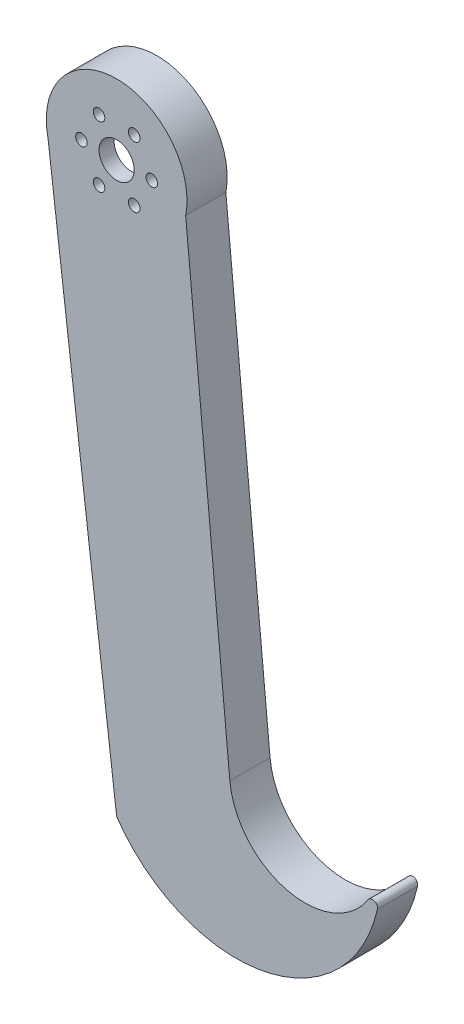
ISO-10303-21;
HEADER;
FILE_DESCRIPTION(('STEP AP214'),'2;1');
FILE_NAME('part.step','',(''),(''),'','','');
FILE_SCHEMA(('AUTOMOTIVE_DESIGN { 1 0 10303 214 1 1 1 1 }'));
ENDSEC;
DATA;
#1=APPLICATION_CONTEXT('core data for automotive mechanical design processes');
#2=APPLICATION_PROTOCOL_DEFINITION('international standard','automotive_design',2000,#1);
#3=PRODUCT_CONTEXT('',#1,'mechanical');
#4=PRODUCT('Part','Part','',(#3));
#5=PRODUCT_RELATED_PRODUCT_CATEGORY('part','',(#4));
#6=PRODUCT_DEFINITION_FORMATION('','',#4);
#7=PRODUCT_DEFINITION_CONTEXT('part definition',#1,'design');
#8=PRODUCT_DEFINITION('design','',#6,#7);
#9=PRODUCT_DEFINITION_SHAPE('','',#8);
#10=(LENGTH_UNIT() NAMED_UNIT(*) SI_UNIT(.MILLI.,.METRE.));
#11=(NAMED_UNIT(*) PLANE_ANGLE_UNIT() SI_UNIT($,.RADIAN.));
#12=(NAMED_UNIT(*) SI_UNIT($,.STERADIAN.) SOLID_ANGLE_UNIT());
#13=UNCERTAINTY_MEASURE_WITH_UNIT(LENGTH_MEASURE(1.E-05),#10,'distance_accuracy_value','');
#14=(GEOMETRIC_REPRESENTATION_CONTEXT(3) GLOBAL_UNCERTAINTY_ASSIGNED_CONTEXT((#13)) GLOBAL_UNIT_ASSIGNED_CONTEXT((#10,
#11,#12)) REPRESENTATION_CONTEXT('',''));
#15=CARTESIAN_POINT('',(0.,0.,0.));
#16=DIRECTION('',(0.,0.,1.));
#17=DIRECTION('',(1.,0.,0.));
#18=AXIS2_PLACEMENT_3D('',#15,#16,#17);
#19=CARTESIAN_POINT('',(0.,0.,-2.));
#20=DIRECTION('',(0.,0.,1.));
#21=DIRECTION('',(1.,0.,0.));
#22=AXIS2_PLACEMENT_3D('',#19,#20,#21);
#23=CYLINDRICAL_SURFACE('',#22,3.5);
#24=CARTESIAN_POINT('',(0.,0.,8.));
#25=DIRECTION('',(0.,0.,1.));
#26=DIRECTION('',(1.,0.,0.));
#27=AXIS2_PLACEMENT_3D('',#24,#25,#26);
#28=CIRCLE('',#27,3.5);
#29=CARTESIAN_POINT('',(3.5,0.,8.));
#30=VERTEX_POINT('',#29);
#31=EDGE_CURVE('E131',#30,#30,#28,.T.);
#32=ORIENTED_EDGE('',*,*,#31,.T.);
#33=EDGE_LOOP('',(#32));
#34=FACE_BOUND('',#33,.T.);
#35=CARTESIAN_POINT('',(0.,0.,5.));
#36=DIRECTION('',(0.,0.,-1.));
#37=DIRECTION('',(-1.,0.,0.));
#38=AXIS2_PLACEMENT_3D('',#35,#36,#37);
#39=CIRCLE('',#38,3.5);
#40=CARTESIAN_POINT('',(-3.5,0.,5.));
#41=VERTEX_POINT('',#40);
#42=EDGE_CURVE('E125',#41,#41,#39,.F.);
#43=ORIENTED_EDGE('',*,*,#42,.F.);
#44=EDGE_LOOP('',(#43));
#45=FACE_BOUND('',#44,.T.);
#46=ADVANCED_FACE('F33',(#34,#45),#23,.F.);
#47=CARTESIAN_POINT('',(0.,0.,8.));
#48=DIRECTION('',(0.,0.,-1.));
#49=DIRECTION('',(-1.,0.,0.));
#50=AXIS2_PLACEMENT_3D('',#47,#48,#49);
#51=CYLINDRICAL_SURFACE('',#50,14.);
#52=CARTESIAN_POINT('',(0.,0.,8.));
#53=DIRECTION('',(0.,0.,1.));
#54=DIRECTION('',(1.,0.,0.));
#55=AXIS2_PLACEMENT_3D('',#52,#53,#54);
#56=CIRCLE('',#55,14.);
#57=CARTESIAN_POINT('',(13.7355783574531,-2.70811506148946,8.));
#58=VERTEX_POINT('',#57);
#59=CARTESIAN_POINT('',(-13.6489972699894,-3.11526459932731,8.));
#60=VERTEX_POINT('',#59);
#61=EDGE_CURVE('E135',#58,#60,#56,.T.);
#62=ORIENTED_EDGE('',*,*,#61,.F.);
#63=DIRECTION('',(0.,0.,1.));
#64=VECTOR('',#63,1.);
#65=CARTESIAN_POINT('',(13.7355783574531,-2.70811506148946,0.));
#66=LINE('',#65,#64);
#67=CARTESIAN_POINT('',(13.7355783574531,-2.70811506148946,0.));
#68=VERTEX_POINT('',#67);
#69=EDGE_CURVE('E111',#68,#58,#66,.T.);
#70=ORIENTED_EDGE('',*,*,#69,.F.);
#71=CARTESIAN_POINT('',(0.,0.,0.));
#72=DIRECTION('',(0.,0.,1.));
#73=DIRECTION('',(1.,0.,0.));
#74=AXIS2_PLACEMENT_3D('',#71,#72,#73);
#75=CIRCLE('',#74,14.);
#76=CARTESIAN_POINT('',(-13.6489972699894,-3.11526459932731,0.));
#77=VERTEX_POINT('',#76);
#78=EDGE_CURVE('E116',#68,#77,#75,.T.);
#79=ORIENTED_EDGE('',*,*,#78,.T.);
#80=DIRECTION('',(0.,0.,1.));
#81=VECTOR('',#80,1.);
#82=CARTESIAN_POINT('',(-13.6489972699894,-3.11526459932734,0.));
#83=LINE('',#82,#81);
#84=EDGE_CURVE('E112',#77,#60,#83,.T.);
#85=ORIENTED_EDGE('',*,*,#84,.T.);
#86=EDGE_LOOP('',(#62,#70,#79,#85));
#87=FACE_BOUND('',#86,.T.);
#88=ADVANCED_FACE('F163',(#87),#51,.T.);
#89=CARTESIAN_POINT('',(0.,0.,8.));
#90=DIRECTION('',(0.,0.,1.));
#91=DIRECTION('',(1.,0.,0.));
#92=AXIS2_PLACEMENT_3D('',#89,#90,#91);
#93=PLANE('',#92);
#94=CARTESIAN_POINT('',(-3.50000000000007,6.06217782649103,8.));
#95=DIRECTION('',(0.,0.,1.));
#96=DIRECTION('',(1.,0.,0.));
#97=AXIS2_PLACEMENT_3D('',#94,#95,#96);
#98=CIRCLE('',#97,1.15);
#99=CARTESIAN_POINT('',(-2.35000000000007,6.06217782649103,8.));
#100=VERTEX_POINT('',#99);
#101=EDGE_CURVE('E201',#100,#100,#98,.T.);
#102=ORIENTED_EDGE('',*,*,#101,.F.);
#103=EDGE_LOOP('',(#102));
#104=FACE_BOUND('',#103,.T.);
#105=CARTESIAN_POINT('',(3.49999999999994,6.06217782649111,8.));
#106=DIRECTION('',(0.,0.,1.));
#107=DIRECTION('',(1.,0.,0.));
#108=AXIS2_PLACEMENT_3D('',#105,#106,#107);
#109=CIRCLE('',#108,1.15);
#110=CARTESIAN_POINT('',(4.64999999999994,6.06217782649111,8.));
#111=VERTEX_POINT('',#110);
#112=EDGE_CURVE('E195',#111,#111,#109,.T.);
#113=ORIENTED_EDGE('',*,*,#112,.F.);
#114=EDGE_LOOP('',(#113));
#115=FACE_BOUND('',#114,.T.);
#116=CARTESIAN_POINT('',(7.,0.,8.));
#117=DIRECTION('',(0.,0.,1.));
#118=DIRECTION('',(1.,0.,0.));
#119=AXIS2_PLACEMENT_3D('',#116,#117,#118);
#120=CIRCLE('',#119,1.15);
#121=CARTESIAN_POINT('',(8.15,0.,8.));
#122=VERTEX_POINT('',#121);
#123=EDGE_CURVE('E189',#122,#122,#120,.T.);
#124=ORIENTED_EDGE('',*,*,#123,.F.);
#125=EDGE_LOOP('',(#124));
#126=FACE_BOUND('',#125,.T.);
#127=CARTESIAN_POINT('',(3.50000000000003,-6.06217782649106,8.));
#128=DIRECTION('',(0.,0.,1.));
#129=DIRECTION('',(1.,0.,0.));
#130=AXIS2_PLACEMENT_3D('',#127,#128,#129);
#131=CIRCLE('',#130,1.15);
#132=CARTESIAN_POINT('',(4.65000000000003,-6.06217782649106,8.));
#133=VERTEX_POINT('',#132);
#134=EDGE_CURVE('E183',#133,#133,#131,.T.);
#135=ORIENTED_EDGE('',*,*,#134,.F.);
#136=EDGE_LOOP('',(#135));
#137=FACE_BOUND('',#136,.T.);
#138=CARTESIAN_POINT('',(-3.49999999999999,-6.06217782649108,8.));
#139=DIRECTION('',(0.,0.,1.));
#140=DIRECTION('',(1.,0.,0.));
#141=AXIS2_PLACEMENT_3D('',#138,#139,#140);
#142=CIRCLE('',#141,1.15);
#143=CARTESIAN_POINT('',(-2.34999999999999,-6.06217782649108,8.));
#144=VERTEX_POINT('',#143);
#145=EDGE_CURVE('E177',#144,#144,#142,.T.);
#146=ORIENTED_EDGE('',*,*,#145,.F.);
#147=EDGE_LOOP('',(#146));
#148=FACE_BOUND('',#147,.T.);
#149=CARTESIAN_POINT('',(-7.,0.,8.));
#150=DIRECTION('',(0.,0.,1.));
#151=DIRECTION('',(1.,0.,0.));
#152=AXIS2_PLACEMENT_3D('',#149,#150,#151);
#153=CIRCLE('',#152,1.15);
#154=CARTESIAN_POINT('',(-5.85,0.,8.));
#155=VERTEX_POINT('',#154);
#156=EDGE_CURVE('E169',#155,#155,#153,.T.);
#157=ORIENTED_EDGE('',*,*,#156,.F.);
#158=EDGE_LOOP('',(#157));
#159=FACE_BOUND('',#158,.T.);
#160=ORIENTED_EDGE('',*,*,#31,.F.);
#161=EDGE_LOOP('',(#160));
#162=FACE_BOUND('',#161,.T.);
#163=DIRECTION('',(0.123137483900924,-0.992389621095742,0.));
#164=VECTOR('',#163,1.);
#165=CARTESIAN_POINT('',(-13.6489972699894,-3.11526459932734,8.));
#166=LINE('',#165,#164);
#167=CARTESIAN_POINT('',(-0.0300732699647852,-112.872898099379,8.));
#168=VERTEX_POINT('',#167);
#169=EDGE_CURVE('E122',#60,#168,#166,.T.);
#170=ORIENTED_EDGE('',*,*,#169,.T.);
#171=CARTESIAN_POINT('',(0.962316351130953,-112.749760615478,8.));
#172=DIRECTION('',(0.,0.,1.));
#173=DIRECTION('',(1.,0.,0.));
#174=AXIS2_PLACEMENT_3D('',#171,#172,#173);
#175=CIRCLE('',#174,1.);
#176=CARTESIAN_POINT('',(0.140884053214486,-113.320066656074,8.));
#177=VERTEX_POINT('',#176);
#178=EDGE_CURVE('E55',#168,#177,#175,.T.);
#179=ORIENTED_EDGE('',*,*,#178,.T.);
#180=CARTESIAN_POINT('',(23.790257885744,-96.9007210968576,8.));
#181=DIRECTION('',(0.,0.,1.));
#182=DIRECTION('',(1.,0.,0.));
#183=AXIS2_PLACEMENT_3D('',#180,#181,#182);
#184=CIRCLE('',#183,28.7904114465856);
#185=CARTESIAN_POINT('',(51.8873570072006,-103.180913149871,8.));
#186=VERTEX_POINT('',#185);
#187=EDGE_CURVE('E124',#177,#186,#184,.T.);
#188=ORIENTED_EDGE('',*,*,#187,.T.);
#189=CARTESIAN_POINT('',(50.9114383693727,-102.962778300889,8.));
#190=DIRECTION('',(0.,0.,1.));
#191=DIRECTION('',(1.,0.,0.));
#192=AXIS2_PLACEMENT_3D('',#189,#190,#191);
#193=CIRCLE('',#192,1.);
#194=CARTESIAN_POINT('',(50.0708413942103,-102.42111722111,8.));
#195=VERTEX_POINT('',#194);
#196=EDGE_CURVE('E145',#186,#195,#193,.T.);
#197=ORIENTED_EDGE('',*,*,#196,.T.);
#198=CARTESIAN_POINT('',(37.4618867667754,-94.2962010244166,8.));
#199=DIRECTION('',(0.,0.,-1.));
#200=DIRECTION('',(1.,0.,0.));
#201=AXIS2_PLACEMENT_3D('',#198,#199,#200);
#202=CIRCLE('',#201,15.);
#203=CARTESIAN_POINT('',(22.5284846509842,-95.7081150614895,8.));
#204=VERTEX_POINT('',#203);
#205=EDGE_CURVE('E127',#195,#204,#202,.T.);
#206=ORIENTED_EDGE('',*,*,#205,.T.);
#207=DIRECTION('',(-0.0941276024715207,0.995560141052746,0.));
#208=VECTOR('',#207,1.);
#209=CARTESIAN_POINT('',(13.7355783574531,-2.70811506148946,8.));
#210=LINE('',#209,#208);
#211=EDGE_CURVE('E110',#204,#58,#210,.T.);
#212=ORIENTED_EDGE('',*,*,#211,.T.);
#213=ORIENTED_EDGE('',*,*,#61,.T.);
#214=EDGE_LOOP('',(#170,#179,#188,#197,#206,#212,#213));
#215=FACE_BOUND('',#214,.T.);
#216=ADVANCED_FACE('F161',(#104,#115,#126,#137,#148,#159,#162,#215),#93,.T.);
#217=CARTESIAN_POINT('',(0.,0.,0.));
#218=DIRECTION('',(0.,0.,1.));
#219=DIRECTION('',(1.,0.,0.));
#220=AXIS2_PLACEMENT_3D('',#217,#218,#219);
#221=PLANE('',#220);
#222=CARTESIAN_POINT('',(0.,0.,0.));
#223=DIRECTION('',(0.,0.,-1.));
#224=DIRECTION('',(-1.,0.,0.));
#225=AXIS2_PLACEMENT_3D('',#222,#223,#224);
#226=CIRCLE('',#225,10.6);
#227=CARTESIAN_POINT('',(-10.6,0.,0.));
#228=VERTEX_POINT('',#227);
#229=EDGE_CURVE('E166',#228,#228,#226,.T.);
#230=ORIENTED_EDGE('',*,*,#229,.F.);
#231=EDGE_LOOP('',(#230));
#232=FACE_BOUND('',#231,.T.);
#233=CARTESIAN_POINT('',(23.790257885744,-96.9007210968576,0.));
#234=DIRECTION('',(0.,0.,1.));
#235=DIRECTION('',(1.,0.,0.));
#236=AXIS2_PLACEMENT_3D('',#233,#234,#235);
#237=CIRCLE('',#236,28.7904114465856);
#238=CARTESIAN_POINT('',(0.140884053214486,-113.320066656074,0.));
#239=VERTEX_POINT('',#238);
#240=CARTESIAN_POINT('',(51.8873570072006,-103.180913149871,0.));
#241=VERTEX_POINT('',#240);
#242=EDGE_CURVE('E103',#239,#241,#237,.T.);
#243=ORIENTED_EDGE('',*,*,#242,.F.);
#244=CARTESIAN_POINT('',(0.962316351130953,-112.749760615478,0.));
#245=DIRECTION('',(0.,0.,1.));
#246=DIRECTION('',(1.,0.,0.));
#247=AXIS2_PLACEMENT_3D('',#244,#245,#246);
#248=CIRCLE('',#247,1.);
#249=CARTESIAN_POINT('',(-0.0300732699647852,-112.872898099379,0.));
#250=VERTEX_POINT('',#249);
#251=EDGE_CURVE('E11',#239,#250,#248,.F.);
#252=ORIENTED_EDGE('',*,*,#251,.T.);
#253=DIRECTION('',(0.123137483900924,-0.992389621095742,0.));
#254=VECTOR('',#253,1.);
#255=CARTESIAN_POINT('',(-13.6489972699894,-3.11526459932734,0.));
#256=LINE('',#255,#254);
#257=EDGE_CURVE('E130',#77,#250,#256,.T.);
#258=ORIENTED_EDGE('',*,*,#257,.F.);
#259=ORIENTED_EDGE('',*,*,#78,.F.);
#260=DIRECTION('',(-0.0941276024715207,0.995560141052746,0.));
#261=VECTOR('',#260,1.);
#262=CARTESIAN_POINT('',(13.7355783574531,-2.70811506148946,0.));
#263=LINE('',#262,#261);
#264=CARTESIAN_POINT('',(22.5284846509842,-95.7081150614895,0.));
#265=VERTEX_POINT('',#264);
#266=EDGE_CURVE('E102',#265,#68,#263,.T.);
#267=ORIENTED_EDGE('',*,*,#266,.F.);
#268=CARTESIAN_POINT('',(37.4618867667754,-94.2962010244166,0.));
#269=DIRECTION('',(0.,0.,-1.));
#270=DIRECTION('',(1.,0.,0.));
#271=AXIS2_PLACEMENT_3D('',#268,#269,#270);
#272=CIRCLE('',#271,15.);
#273=CARTESIAN_POINT('',(50.0708413942103,-102.42111722111,0.));
#274=VERTEX_POINT('',#273);
#275=EDGE_CURVE('E90',#274,#265,#272,.T.);
#276=ORIENTED_EDGE('',*,*,#275,.F.);
#277=CARTESIAN_POINT('',(50.9114383693727,-102.962778300889,0.));
#278=DIRECTION('',(0.,0.,1.));
#279=DIRECTION('',(1.,0.,0.));
#280=AXIS2_PLACEMENT_3D('',#277,#278,#279);
#281=CIRCLE('',#280,1.);
#282=EDGE_CURVE('E148',#274,#241,#281,.F.);
#283=ORIENTED_EDGE('',*,*,#282,.T.);
#284=EDGE_LOOP('',(#243,#252,#258,#259,#267,#276,#283));
#285=FACE_BOUND('',#284,.T.);
#286=ADVANCED_FACE('F114',(#232,#285),#221,.F.);
#287=CARTESIAN_POINT('',(13.7355783574531,-2.70811506148946,0.));
#288=DIRECTION('',(0.995560141052746,0.0941276024715207,0.));
#289=DIRECTION('',(-0.0941276024715207,0.995560141052746,0.));
#290=AXIS2_PLACEMENT_3D('',#287,#288,#289);
#291=PLANE('',#290);
#292=ORIENTED_EDGE('',*,*,#211,.F.);
#293=DIRECTION('',(0.,0.,1.));
#294=VECTOR('',#293,1.);
#295=CARTESIAN_POINT('',(22.5284846509842,-95.7081150614895,0.));
#296=LINE('',#295,#294);
#297=EDGE_CURVE('E94',#265,#204,#296,.T.);
#298=ORIENTED_EDGE('',*,*,#297,.F.);
#299=ORIENTED_EDGE('',*,*,#266,.T.);
#300=ORIENTED_EDGE('',*,*,#69,.T.);
#301=EDGE_LOOP('',(#292,#298,#299,#300));
#302=FACE_BOUND('',#301,.T.);
#303=ADVANCED_FACE('F107',(#302),#291,.T.);
#304=CARTESIAN_POINT('',(37.4618867667754,-94.2962010244166,0.));
#305=DIRECTION('',(0.,0.,1.));
#306=DIRECTION('',(1.,0.,0.));
#307=AXIS2_PLACEMENT_3D('',#304,#305,#306);
#308=CYLINDRICAL_SURFACE('',#307,15.);
#309=ORIENTED_EDGE('',*,*,#205,.F.);
#310=DIRECTION('',(0.,0.,1.));
#311=VECTOR('',#310,1.);
#312=CARTESIAN_POINT('',(50.0708413942103,-102.42111722111,0.));
#313=LINE('',#312,#311);
#314=EDGE_CURVE('E97',#195,#274,#313,.F.);
#315=ORIENTED_EDGE('',*,*,#314,.T.);
#316=ORIENTED_EDGE('',*,*,#275,.T.);
#317=ORIENTED_EDGE('',*,*,#297,.T.);
#318=EDGE_LOOP('',(#309,#315,#316,#317));
#319=FACE_BOUND('',#318,.T.);
#320=ADVANCED_FACE('F93',(#319),#308,.F.);
#321=CARTESIAN_POINT('',(23.790257885744,-96.9007210968576,0.));
#322=DIRECTION('',(0.,0.,1.));
#323=DIRECTION('',(1.,0.,0.));
#324=AXIS2_PLACEMENT_3D('',#321,#322,#323);
#325=CYLINDRICAL_SURFACE('',#324,28.7904114465856);
#326=ORIENTED_EDGE('',*,*,#187,.F.);
#327=DIRECTION('',(0.,0.,1.));
#328=VECTOR('',#327,1.);
#329=CARTESIAN_POINT('',(0.140884053214489,-113.320066656074,0.));
#330=LINE('',#329,#328);
#331=EDGE_CURVE('E41',#177,#239,#330,.F.);
#332=ORIENTED_EDGE('',*,*,#331,.T.);
#333=ORIENTED_EDGE('',*,*,#242,.T.);
#334=DIRECTION('',(0.,0.,1.));
#335=VECTOR('',#334,1.);
#336=CARTESIAN_POINT('',(51.8873570072006,-103.180913149871,0.));
#337=LINE('',#336,#335);
#338=EDGE_CURVE('E138',#241,#186,#337,.T.);
#339=ORIENTED_EDGE('',*,*,#338,.T.);
#340=EDGE_LOOP('',(#326,#332,#333,#339));
#341=FACE_BOUND('',#340,.T.);
#342=ADVANCED_FACE('F256',(#341),#325,.T.);
#343=CARTESIAN_POINT('',(-13.6489972699894,-3.11526459932734,0.));
#344=DIRECTION('',(-0.992389621095742,-0.123137483900924,0.));
#345=DIRECTION('',(0.123137483900924,-0.992389621095742,0.));
#346=AXIS2_PLACEMENT_3D('',#343,#344,#345);
#347=PLANE('',#346);
#348=ORIENTED_EDGE('',*,*,#257,.T.);
#349=DIRECTION('',(0.,0.,1.));
#350=VECTOR('',#349,1.);
#351=CARTESIAN_POINT('',(-0.0300732699647886,-112.872898099379,0.));
#352=LINE('',#351,#350);
#353=EDGE_CURVE('E150',#250,#168,#352,.T.);
#354=ORIENTED_EDGE('',*,*,#353,.T.);
#355=ORIENTED_EDGE('',*,*,#169,.F.);
#356=ORIENTED_EDGE('',*,*,#84,.F.);
#357=EDGE_LOOP('',(#348,#354,#355,#356));
#358=FACE_BOUND('',#357,.T.);
#359=ADVANCED_FACE('F157',(#358),#347,.T.);
#360=CARTESIAN_POINT('',(0.,0.,5.));
#361=DIRECTION('',(0.,0.,-1.));
#362=DIRECTION('',(-1.,0.,0.));
#363=AXIS2_PLACEMENT_3D('',#360,#361,#362);
#364=PLANE('',#363);
#365=CARTESIAN_POINT('',(-3.50000000000007,6.06217782649103,5.));
#366=DIRECTION('',(0.,0.,-1.));
#367=DIRECTION('',(-1.,0.,0.));
#368=AXIS2_PLACEMENT_3D('',#365,#366,#367);
#369=CIRCLE('',#368,1.15);
#370=CARTESIAN_POINT('',(-4.65000000000007,6.06217782649103,5.));
#371=VERTEX_POINT('',#370);
#372=EDGE_CURVE('E204',#371,#371,#369,.T.);
#373=ORIENTED_EDGE('',*,*,#372,.F.);
#374=EDGE_LOOP('',(#373));
#375=FACE_BOUND('',#374,.T.);
#376=CARTESIAN_POINT('',(3.49999999999994,6.06217782649111,5.));
#377=DIRECTION('',(0.,0.,-1.));
#378=DIRECTION('',(-1.,0.,0.));
#379=AXIS2_PLACEMENT_3D('',#376,#377,#378);
#380=CIRCLE('',#379,1.15);
#381=CARTESIAN_POINT('',(2.34999999999994,6.06217782649111,5.));
#382=VERTEX_POINT('',#381);
#383=EDGE_CURVE('E198',#382,#382,#380,.T.);
#384=ORIENTED_EDGE('',*,*,#383,.F.);
#385=EDGE_LOOP('',(#384));
#386=FACE_BOUND('',#385,.T.);
#387=CARTESIAN_POINT('',(7.,0.,5.));
#388=DIRECTION('',(0.,0.,-1.));
#389=DIRECTION('',(-1.,0.,0.));
#390=AXIS2_PLACEMENT_3D('',#387,#388,#389);
#391=CIRCLE('',#390,1.15);
#392=CARTESIAN_POINT('',(5.85,0.,5.));
#393=VERTEX_POINT('',#392);
#394=EDGE_CURVE('E192',#393,#393,#391,.T.);
#395=ORIENTED_EDGE('',*,*,#394,.F.);
#396=EDGE_LOOP('',(#395));
#397=FACE_BOUND('',#396,.T.);
#398=CARTESIAN_POINT('',(3.50000000000003,-6.06217782649106,5.));
#399=DIRECTION('',(0.,0.,-1.));
#400=DIRECTION('',(-1.,0.,0.));
#401=AXIS2_PLACEMENT_3D('',#398,#399,#400);
#402=CIRCLE('',#401,1.15);
#403=CARTESIAN_POINT('',(2.35000000000003,-6.06217782649106,5.));
#404=VERTEX_POINT('',#403);
#405=EDGE_CURVE('E186',#404,#404,#402,.T.);
#406=ORIENTED_EDGE('',*,*,#405,.F.);
#407=EDGE_LOOP('',(#406));
#408=FACE_BOUND('',#407,.T.);
#409=CARTESIAN_POINT('',(-3.49999999999999,-6.06217782649108,5.));
#410=DIRECTION('',(0.,0.,-1.));
#411=DIRECTION('',(-1.,0.,0.));
#412=AXIS2_PLACEMENT_3D('',#409,#410,#411);
#413=CIRCLE('',#412,1.15);
#414=CARTESIAN_POINT('',(-4.64999999999999,-6.06217782649108,5.));
#415=VERTEX_POINT('',#414);
#416=EDGE_CURVE('E180',#415,#415,#413,.T.);
#417=ORIENTED_EDGE('',*,*,#416,.F.);
#418=EDGE_LOOP('',(#417));
#419=FACE_BOUND('',#418,.T.);
#420=CARTESIAN_POINT('',(-7.,0.,5.));
#421=DIRECTION('',(0.,0.,-1.));
#422=DIRECTION('',(-1.,0.,0.));
#423=AXIS2_PLACEMENT_3D('',#420,#421,#422);
#424=CIRCLE('',#423,1.15);
#425=CARTESIAN_POINT('',(-8.15,0.,5.));
#426=VERTEX_POINT('',#425);
#427=EDGE_CURVE('E174',#426,#426,#424,.T.);
#428=ORIENTED_EDGE('',*,*,#427,.F.);
#429=EDGE_LOOP('',(#428));
#430=FACE_BOUND('',#429,.T.);
#431=CARTESIAN_POINT('',(0.,0.,5.));
#432=DIRECTION('',(0.,0.,-1.));
#433=DIRECTION('',(-1.,0.,0.));
#434=AXIS2_PLACEMENT_3D('',#431,#432,#433);
#435=CIRCLE('',#434,10.6);
#436=CARTESIAN_POINT('',(-10.6,0.,5.));
#437=VERTEX_POINT('',#436);
#438=EDGE_CURVE('E142',#437,#437,#435,.T.);
#439=ORIENTED_EDGE('',*,*,#438,.T.);
#440=EDGE_LOOP('',(#439));
#441=FACE_BOUND('',#440,.T.);
#442=ORIENTED_EDGE('',*,*,#42,.T.);
#443=EDGE_LOOP('',(#442));
#444=FACE_BOUND('',#443,.T.);
#445=ADVANCED_FACE('F210',(#375,#386,#397,#408,#419,#430,#441,#444),#364,.T.);
#446=CARTESIAN_POINT('',(0.,0.,5.));
#447=DIRECTION('',(0.,0.,-1.));
#448=DIRECTION('',(-1.,0.,0.));
#449=AXIS2_PLACEMENT_3D('',#446,#447,#448);
#450=CYLINDRICAL_SURFACE('',#449,10.6);
#451=ORIENTED_EDGE('',*,*,#438,.F.);
#452=EDGE_LOOP('',(#451));
#453=FACE_BOUND('',#452,.T.);
#454=ORIENTED_EDGE('',*,*,#229,.T.);
#455=EDGE_LOOP('',(#454));
#456=FACE_BOUND('',#455,.T.);
#457=ADVANCED_FACE('F213',(#453,#456),#450,.F.);
#458=CARTESIAN_POINT('',(-7.,0.,10.));
#459=DIRECTION('',(0.,0.,-1.));
#460=DIRECTION('',(-1.,0.,0.));
#461=AXIS2_PLACEMENT_3D('',#458,#459,#460);
#462=CYLINDRICAL_SURFACE('',#461,1.15);
#463=ORIENTED_EDGE('',*,*,#156,.T.);
#464=EDGE_LOOP('',(#463));
#465=FACE_BOUND('',#464,.T.);
#466=ORIENTED_EDGE('',*,*,#427,.T.);
#467=EDGE_LOOP('',(#466));
#468=FACE_BOUND('',#467,.T.);
#469=ADVANCED_FACE('F267',(#465,#468),#462,.F.);
#470=CARTESIAN_POINT('',(-3.49999999999999,-6.06217782649108,10.));
#471=DIRECTION('',(0.,0.,-1.));
#472=DIRECTION('',(-1.,0.,0.));
#473=AXIS2_PLACEMENT_3D('',#470,#471,#472);
#474=CYLINDRICAL_SURFACE('',#473,1.15);
#475=ORIENTED_EDGE('',*,*,#145,.T.);
#476=EDGE_LOOP('',(#475));
#477=FACE_BOUND('',#476,.T.);
#478=ORIENTED_EDGE('',*,*,#416,.T.);
#479=EDGE_LOOP('',(#478));
#480=FACE_BOUND('',#479,.T.);
#481=ADVANCED_FACE('F272',(#477,#480),#474,.F.);
#482=CARTESIAN_POINT('',(3.50000000000003,-6.06217782649106,10.));
#483=DIRECTION('',(0.,0.,-1.));
#484=DIRECTION('',(-1.,0.,0.));
#485=AXIS2_PLACEMENT_3D('',#482,#483,#484);
#486=CYLINDRICAL_SURFACE('',#485,1.15);
#487=ORIENTED_EDGE('',*,*,#134,.T.);
#488=EDGE_LOOP('',(#487));
#489=FACE_BOUND('',#488,.T.);
#490=ORIENTED_EDGE('',*,*,#405,.T.);
#491=EDGE_LOOP('',(#490));
#492=FACE_BOUND('',#491,.T.);
#493=ADVANCED_FACE('F276',(#489,#492),#486,.F.);
#494=CARTESIAN_POINT('',(7.,0.,10.));
#495=DIRECTION('',(0.,0.,-1.));
#496=DIRECTION('',(-1.,0.,0.));
#497=AXIS2_PLACEMENT_3D('',#494,#495,#496);
#498=CYLINDRICAL_SURFACE('',#497,1.15);
#499=ORIENTED_EDGE('',*,*,#123,.T.);
#500=EDGE_LOOP('',(#499));
#501=FACE_BOUND('',#500,.T.);
#502=ORIENTED_EDGE('',*,*,#394,.T.);
#503=EDGE_LOOP('',(#502));
#504=FACE_BOUND('',#503,.T.);
#505=ADVANCED_FACE('F280',(#501,#504),#498,.F.);
#506=CARTESIAN_POINT('',(3.49999999999994,6.06217782649111,10.));
#507=DIRECTION('',(0.,0.,-1.));
#508=DIRECTION('',(-1.,0.,0.));
#509=AXIS2_PLACEMENT_3D('',#506,#507,#508);
#510=CYLINDRICAL_SURFACE('',#509,1.15);
#511=ORIENTED_EDGE('',*,*,#112,.T.);
#512=EDGE_LOOP('',(#511));
#513=FACE_BOUND('',#512,.T.);
#514=ORIENTED_EDGE('',*,*,#383,.T.);
#515=EDGE_LOOP('',(#514));
#516=FACE_BOUND('',#515,.T.);
#517=ADVANCED_FACE('F251',(#513,#516),#510,.F.);
#518=CARTESIAN_POINT('',(-3.50000000000007,6.06217782649103,10.));
#519=DIRECTION('',(0.,0.,-1.));
#520=DIRECTION('',(-1.,0.,0.));
#521=AXIS2_PLACEMENT_3D('',#518,#519,#520);
#522=CYLINDRICAL_SURFACE('',#521,1.15);
#523=ORIENTED_EDGE('',*,*,#101,.T.);
#524=EDGE_LOOP('',(#523));
#525=FACE_BOUND('',#524,.T.);
#526=ORIENTED_EDGE('',*,*,#372,.T.);
#527=EDGE_LOOP('',(#526));
#528=FACE_BOUND('',#527,.T.);
#529=ADVANCED_FACE('F208',(#525,#528),#522,.F.);
#530=CARTESIAN_POINT('',(50.9114383693727,-102.962778300889,0.));
#531=DIRECTION('',(0.,0.,-1.));
#532=DIRECTION('',(-1.,0.,0.));
#533=AXIS2_PLACEMENT_3D('',#530,#531,#532);
#534=CYLINDRICAL_SURFACE('',#533,1.);
#535=ORIENTED_EDGE('',*,*,#282,.F.);
#536=ORIENTED_EDGE('',*,*,#314,.F.);
#537=ORIENTED_EDGE('',*,*,#196,.F.);
#538=ORIENTED_EDGE('',*,*,#338,.F.);
#539=EDGE_LOOP('',(#535,#536,#537,#538));
#540=FACE_BOUND('',#539,.T.);
#541=ADVANCED_FACE('F244',(#540),#534,.T.);
#542=CARTESIAN_POINT('',(0.962316351130953,-112.749760615478,0.));
#543=DIRECTION('',(0.,0.,1.));
#544=DIRECTION('',(1.,0.,0.));
#545=AXIS2_PLACEMENT_3D('',#542,#543,#544);
#546=CYLINDRICAL_SURFACE('',#545,1.);
#547=ORIENTED_EDGE('',*,*,#251,.F.);
#548=ORIENTED_EDGE('',*,*,#331,.F.);
#549=ORIENTED_EDGE('',*,*,#178,.F.);
#550=ORIENTED_EDGE('',*,*,#353,.F.);
#551=EDGE_LOOP('',(#547,#548,#549,#550));
#552=FACE_BOUND('',#551,.T.);
#553=ADVANCED_FACE('F35',(#552),#546,.T.);
#554=CLOSED_SHELL('',(#46,#88,#216,#286,#303,#320,#342,#359,#445,#457,#469,#481,#493,#505,#517,
#529,#541,#553));
#555=MANIFOLD_SOLID_BREP('B2',#554);
#556=ADVANCED_BREP_SHAPE_REPRESENTATION('',(#18,#555),#14);
#557=SHAPE_DEFINITION_REPRESENTATION(#9,#556);
ENDSEC;
END-ISO-10303-21;
